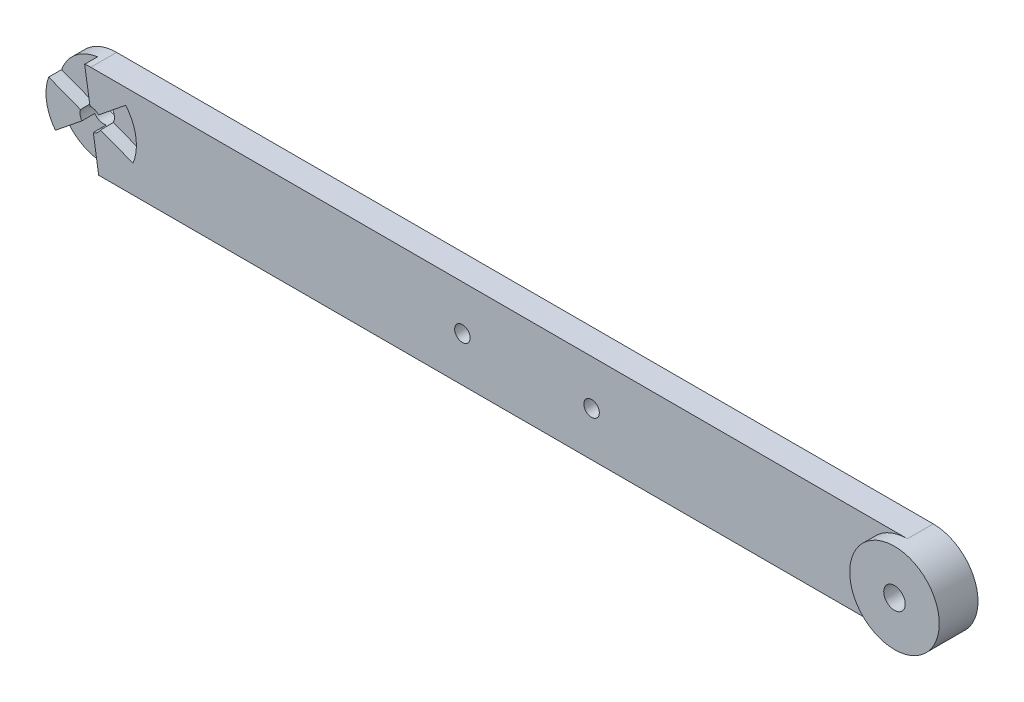
ISO-10303-21;
HEADER;
FILE_DESCRIPTION(('STEP AP214'),'2;1');
FILE_NAME('part.step','',(''),(''),'','','');
FILE_SCHEMA(('AUTOMOTIVE_DESIGN { 1 0 10303 214 1 1 1 1 }'));
ENDSEC;
DATA;
#1=APPLICATION_CONTEXT('core data for automotive mechanical design processes');
#2=APPLICATION_PROTOCOL_DEFINITION('international standard','automotive_design',2000,#1);
#3=PRODUCT_CONTEXT('',#1,'mechanical');
#4=PRODUCT('Part','Part','',(#3));
#5=PRODUCT_RELATED_PRODUCT_CATEGORY('part','',(#4));
#6=PRODUCT_DEFINITION_FORMATION('','',#4);
#7=PRODUCT_DEFINITION_CONTEXT('part definition',#1,'design');
#8=PRODUCT_DEFINITION('design','',#6,#7);
#9=PRODUCT_DEFINITION_SHAPE('','',#8);
#10=(LENGTH_UNIT() NAMED_UNIT(*) SI_UNIT(.MILLI.,.METRE.));
#11=(NAMED_UNIT(*) PLANE_ANGLE_UNIT() SI_UNIT($,.RADIAN.));
#12=(NAMED_UNIT(*) SI_UNIT($,.STERADIAN.) SOLID_ANGLE_UNIT());
#13=UNCERTAINTY_MEASURE_WITH_UNIT(LENGTH_MEASURE(1.E-05),#10,'distance_accuracy_value','');
#14=(GEOMETRIC_REPRESENTATION_CONTEXT(3) GLOBAL_UNCERTAINTY_ASSIGNED_CONTEXT((#13)) GLOBAL_UNIT_ASSIGNED_CONTEXT((#10,
#11,#12)) REPRESENTATION_CONTEXT('',''));
#15=CARTESIAN_POINT('',(0.,0.,0.));
#16=DIRECTION('',(0.,0.,1.));
#17=DIRECTION('',(1.,0.,0.));
#18=AXIS2_PLACEMENT_3D('',#15,#16,#17);
#19=CARTESIAN_POINT('',(0.,0.,0.));
#20=DIRECTION('',(0.,0.,-1.));
#21=DIRECTION('',(1.,0.,0.));
#22=AXIS2_PLACEMENT_3D('',#19,#20,#21);
#23=PLANE('',#22);
#24=CARTESIAN_POINT('',(116.336074353914,-0.0507842874859082,0.));
#25=DIRECTION('',(0.,0.,-1.));
#26=DIRECTION('',(-1.,0.,0.));
#27=AXIS2_PLACEMENT_3D('',#24,#25,#26);
#28=CIRCLE('',#27,1.79999999999999);
#29=CARTESIAN_POINT('',(114.536074353914,-0.0507842874859082,0.));
#30=VERTEX_POINT('',#29);
#31=EDGE_CURVE('E523',#30,#30,#28,.T.);
#32=ORIENTED_EDGE('',*,*,#31,.T.);
#33=EDGE_LOOP('',(#32));
#34=FACE_BOUND('',#33,.T.);
#35=CARTESIAN_POINT('',(86.3361656290088,0.0015439506771131,0.));
#36=DIRECTION('',(0.,0.,-1.));
#37=DIRECTION('',(-1.,0.,0.));
#38=AXIS2_PLACEMENT_3D('',#35,#36,#37);
#39=CIRCLE('',#38,1.79999999999999);
#40=CARTESIAN_POINT('',(84.5361656290088,0.0015439506771131,0.));
#41=VERTEX_POINT('',#40);
#42=EDGE_CURVE('E218',#41,#41,#39,.T.);
#43=ORIENTED_EDGE('',*,*,#42,.T.);
#44=EDGE_LOOP('',(#43));
#45=FACE_BOUND('',#44,.T.);
#46=CARTESIAN_POINT('',(189.7,0.,0.));
#47=DIRECTION('',(0.,0.,-1.));
#48=DIRECTION('',(-1.,0.,0.));
#49=AXIS2_PLACEMENT_3D('',#46,#47,#48);
#50=CIRCLE('',#49,10.4);
#51=CARTESIAN_POINT('',(189.7,-10.4,0.));
#52=VERTEX_POINT('',#51);
#53=CARTESIAN_POINT('',(189.7,10.4,0.));
#54=VERTEX_POINT('',#53);
#55=EDGE_CURVE('E201',#52,#54,#50,.T.);
#56=ORIENTED_EDGE('',*,*,#55,.T.);
#57=DIRECTION('',(-1.,0.,0.));
#58=VECTOR('',#57,1.);
#59=CARTESIAN_POINT('',(0.,10.4,0.));
#60=LINE('',#59,#58);
#61=CARTESIAN_POINT('',(0.,10.4,0.));
#62=VERTEX_POINT('',#61);
#63=EDGE_CURVE('E204',#54,#62,#60,.T.);
#64=ORIENTED_EDGE('',*,*,#63,.T.);
#65=CARTESIAN_POINT('',(0.,0.,0.));
#66=DIRECTION('',(0.,0.,1.));
#67=DIRECTION('',(1.,0.,0.));
#68=AXIS2_PLACEMENT_3D('',#65,#66,#67);
#69=CIRCLE('',#68,10.4);
#70=CARTESIAN_POINT('',(-1.4182915789947,10.3028369392587,0.));
#71=VERTEX_POINT('',#70);
#72=EDGE_CURVE('E299',#62,#71,#69,.T.);
#73=ORIENTED_EDGE('',*,*,#72,.T.);
#74=DIRECTION('',(-0.155400074642872,0.987851616793226,0.));
#75=VECTOR('',#74,1.);
#76=CARTESIAN_POINT('',(0.197570323358645,0.0310800149285744,0.));
#77=LINE('',#76,#75);
#78=CARTESIAN_POINT('',(-0.189684667139674,2.49279355885162,0.));
#79=VERTEX_POINT('',#78);
#80=EDGE_CURVE('E264',#79,#71,#77,.T.);
#81=ORIENTED_EDGE('',*,*,#80,.F.);
#82=CARTESIAN_POINT('',(0.,0.,0.));
#83=DIRECTION('',(0.,0.,1.));
#84=DIRECTION('',(1.,0.,0.));
#85=AXIS2_PLACEMENT_3D('',#82,#83,#84);
#86=CIRCLE('',#85,2.5);
#87=CARTESIAN_POINT('',(1.81257772647093,1.72179034307359,0.));
#88=VERTEX_POINT('',#87);
#89=EDGE_CURVE('E205',#88,#79,#86,.T.);
#90=ORIENTED_EDGE('',*,*,#89,.F.);
#91=DIRECTION('',(0.77780455799102,0.628506220787347,0.));
#92=VECTOR('',#91,1.);
#93=CARTESIAN_POINT('',(-0.12570124415747,0.155560911598204,0.));
#94=LINE('',#93,#92);
#95=CARTESIAN_POINT('',(8.11755938414236,6.81654088559017,0.));
#96=VERTEX_POINT('',#95);
#97=EDGE_CURVE('E215',#88,#96,#94,.T.);
#98=ORIENTED_EDGE('',*,*,#97,.T.);
#99=CARTESIAN_POINT('',(0.,0.,0.));
#100=DIRECTION('',(0.,0.,-1.));
#101=DIRECTION('',(-1.,0.,0.));
#102=AXIS2_PLACEMENT_3D('',#99,#100,#101);
#103=CIRCLE('',#102,10.6);
#104=CARTESIAN_POINT('',(9.81833910652518,-3.99502405365455,0.));
#105=VERTEX_POINT('',#104);
#106=EDGE_CURVE('E234',#96,#105,#103,.T.);
#107=ORIENTED_EDGE('',*,*,#106,.T.);
#108=DIRECTION('',(0.933204632633903,-0.359345396005879,0.));
#109=VECTOR('',#108,1.);
#110=CARTESIAN_POINT('',(-0.0718690792011758,-0.186640926526781,0.));
#111=LINE('',#110,#109);
#112=CARTESIAN_POINT('',(2.25366488192557,-1.08212503897443,0.));
#113=VERTEX_POINT('',#112);
#114=EDGE_CURVE('E224',#113,#105,#111,.T.);
#115=ORIENTED_EDGE('',*,*,#114,.F.);
#116=CARTESIAN_POINT('',(0.584825313856982,-2.43063352899446,0.));
#117=VERTEX_POINT('',#116);
#118=EDGE_CURVE('E287',#117,#113,#86,.T.);
#119=ORIENTED_EDGE('',*,*,#118,.F.);
#120=DIRECTION('',(0.155400074642879,-0.987851616793225,0.));
#121=VECTOR('',#120,1.);
#122=CARTESIAN_POINT('',(0.197570323358645,0.0310800149285759,0.));
#123=LINE('',#122,#121);
#124=CARTESIAN_POINT('',(1.83849552444079,-10.4,0.));
#125=VERTEX_POINT('',#124);
#126=EDGE_CURVE('E203',#117,#125,#123,.T.);
#127=ORIENTED_EDGE('',*,*,#126,.T.);
#128=DIRECTION('',(-1.,0.,0.));
#129=VECTOR('',#128,1.);
#130=CARTESIAN_POINT('',(0.,-10.4,0.));
#131=LINE('',#130,#129);
#132=EDGE_CURVE('E191',#52,#125,#131,.T.);
#133=ORIENTED_EDGE('',*,*,#132,.F.);
#134=EDGE_LOOP('',(#56,#64,#73,#81,#90,#98,#107,#115,#119,#127,#133));
#135=FACE_BOUND('',#134,.T.);
#136=ADVANCED_FACE('F71',(#34,#45,#135),#23,.F.);
#137=CARTESIAN_POINT('',(0.,0.,-6.));
#138=DIRECTION('',(0.,0.,1.));
#139=DIRECTION('',(-1.,0.,0.));
#140=AXIS2_PLACEMENT_3D('',#137,#138,#139);
#141=CYLINDRICAL_SURFACE('',#140,2.5);
#142=CARTESIAN_POINT('',(0.,0.,-6.));
#143=DIRECTION('',(0.,0.,1.));
#144=DIRECTION('',(1.,0.,0.));
#145=AXIS2_PLACEMENT_3D('',#142,#143,#144);
#146=CIRCLE('',#145,2.5);
#147=CARTESIAN_POINT('',(2.5,0.,-6.));
#148=VERTEX_POINT('',#147);
#149=EDGE_CURVE('E295',#148,#148,#146,.T.);
#150=ORIENTED_EDGE('',*,*,#149,.F.);
#151=EDGE_LOOP('',(#150));
#152=FACE_BOUND('',#151,.T.);
#153=CARTESIAN_POINT('',(0.,0.,-3.));
#154=DIRECTION('',(0.,0.,-1.));
#155=DIRECTION('',(-1.,0.,0.));
#156=AXIS2_PLACEMENT_3D('',#153,#154,#155);
#157=CIRCLE('',#156,2.5);
#158=CARTESIAN_POINT('',(-2.06398021478588,-1.41066851987717,-3.));
#159=VERTEX_POINT('',#158);
#160=CARTESIAN_POINT('',(0.584825313856982,-2.43063352899446,-3.));
#161=VERTEX_POINT('',#160);
#162=EDGE_CURVE('E249',#159,#161,#157,.F.);
#163=ORIENTED_EDGE('',*,*,#162,.T.);
#164=DIRECTION('',(0.,0.,1.));
#165=VECTOR('',#164,1.);
#166=CARTESIAN_POINT('',(0.584825313856982,-2.43063352899446,-3.));
#167=LINE('',#166,#165);
#168=EDGE_CURVE('E94',#161,#117,#167,.T.);
#169=ORIENTED_EDGE('',*,*,#168,.T.);
#170=ORIENTED_EDGE('',*,*,#118,.T.);
#171=DIRECTION('',(0.,0.,1.));
#172=VECTOR('',#171,1.);
#173=CARTESIAN_POINT('',(2.25366488192557,-1.08212503897443,-3.));
#174=LINE('',#173,#172);
#175=CARTESIAN_POINT('',(2.25366488192557,-1.08212503897443,-3.));
#176=VERTEX_POINT('',#175);
#177=EDGE_CURVE('E242',#176,#113,#174,.T.);
#178=ORIENTED_EDGE('',*,*,#177,.F.);
#179=CARTESIAN_POINT('',(0.,0.,-3.));
#180=DIRECTION('',(0.,0.,-1.));
#181=DIRECTION('',(-1.,0.,0.));
#182=AXIS2_PLACEMENT_3D('',#179,#180,#181);
#183=CIRCLE('',#182,2.5);
#184=CARTESIAN_POINT('',(1.81257772647093,1.72179034307359,-3.));
#185=VERTEX_POINT('',#184);
#186=EDGE_CURVE('E229',#176,#185,#183,.F.);
#187=ORIENTED_EDGE('',*,*,#186,.T.);
#188=DIRECTION('',(0.,0.,1.));
#189=VECTOR('',#188,1.);
#190=CARTESIAN_POINT('',(1.81257772647093,1.72179034307359,-3.));
#191=LINE('',#190,#189);
#192=EDGE_CURVE('E239',#185,#88,#191,.T.);
#193=ORIENTED_EDGE('',*,*,#192,.T.);
#194=ORIENTED_EDGE('',*,*,#89,.T.);
#195=DIRECTION('',(0.,0.,1.));
#196=VECTOR('',#195,1.);
#197=CARTESIAN_POINT('',(-0.189684667139674,2.49279355885162,-3.));
#198=LINE('',#197,#196);
#199=CARTESIAN_POINT('',(-0.189684667139674,2.49279355885162,-3.));
#200=VERTEX_POINT('',#199);
#201=EDGE_CURVE('E281',#200,#79,#198,.T.);
#202=ORIENTED_EDGE('',*,*,#201,.F.);
#203=CARTESIAN_POINT('',(0.,0.,-3.));
#204=DIRECTION('',(0.,0.,-1.));
#205=DIRECTION('',(-1.,0.,0.));
#206=AXIS2_PLACEMENT_3D('',#203,#204,#205);
#207=CIRCLE('',#206,2.5);
#208=CARTESIAN_POINT('',(-2.39740304032791,0.708843185920889,-3.));
#209=VERTEX_POINT('',#208);
#210=EDGE_CURVE('E272',#200,#209,#207,.F.);
#211=ORIENTED_EDGE('',*,*,#210,.T.);
#212=DIRECTION('',(0.,0.,1.));
#213=VECTOR('',#212,1.);
#214=CARTESIAN_POINT('',(-2.39740304032791,0.708843185920889,-3.));
#215=LINE('',#214,#213);
#216=CARTESIAN_POINT('',(-2.39740304032791,0.708843185920889,0.));
#217=VERTEX_POINT('',#216);
#218=EDGE_CURVE('E291',#209,#217,#215,.T.);
#219=ORIENTED_EDGE('',*,*,#218,.T.);
#220=CARTESIAN_POINT('',(-2.06398021478588,-1.41066851987717,0.));
#221=VERTEX_POINT('',#220);
#222=EDGE_CURVE('E312',#217,#221,#86,.T.);
#223=ORIENTED_EDGE('',*,*,#222,.T.);
#224=DIRECTION('',(0.,0.,1.));
#225=VECTOR('',#224,1.);
#226=CARTESIAN_POINT('',(-2.06398021478588,-1.41066851987717,-3.));
#227=LINE('',#226,#225);
#228=EDGE_CURVE('E258',#159,#221,#227,.T.);
#229=ORIENTED_EDGE('',*,*,#228,.F.);
#230=EDGE_LOOP('',(#163,#169,#170,#178,#187,#193,#194,#202,#211,#219,#223,#229));
#231=FACE_BOUND('',#230,.T.);
#232=ADVANCED_FACE('F73',(#152,#231),#141,.F.);
#233=CARTESIAN_POINT('',(0.,0.,-6.));
#234=DIRECTION('',(0.,0.,1.));
#235=DIRECTION('',(-1.,0.,0.));
#236=AXIS2_PLACEMENT_3D('',#233,#234,#235);
#237=CYLINDRICAL_SURFACE('',#236,10.4);
#238=DIRECTION('',(0.,0.,1.));
#239=VECTOR('',#238,1.);
#240=CARTESIAN_POINT('',(-8.21337273094933,-6.37969500701232,-3.));
#241=LINE('',#240,#239);
#242=CARTESIAN_POINT('',(-8.21337273094933,-6.37969500701232,-3.));
#243=VERTEX_POINT('',#242);
#244=CARTESIAN_POINT('',(-8.21337273094933,-6.37969500701232,0.));
#245=VERTEX_POINT('',#244);
#246=EDGE_CURVE('E261',#243,#245,#241,.T.);
#247=ORIENTED_EDGE('',*,*,#246,.T.);
#248=CARTESIAN_POINT('',(-9.77540246834642,3.54986007919279,0.));
#249=VERTEX_POINT('',#248);
#250=EDGE_CURVE('E315',#249,#245,#69,.T.);
#251=ORIENTED_EDGE('',*,*,#250,.F.);
#252=DIRECTION('',(0.,0.,1.));
#253=VECTOR('',#252,1.);
#254=CARTESIAN_POINT('',(-9.77540246834642,3.54986007919279,-3.));
#255=LINE('',#254,#253);
#256=CARTESIAN_POINT('',(-9.77540246834642,3.54986007919279,-3.));
#257=VERTEX_POINT('',#256);
#258=EDGE_CURVE('E288',#257,#249,#255,.T.);
#259=ORIENTED_EDGE('',*,*,#258,.F.);
#260=CARTESIAN_POINT('',(0.,0.,-3.));
#261=DIRECTION('',(0.,0.,-1.));
#262=DIRECTION('',(-1.,0.,0.));
#263=AXIS2_PLACEMENT_3D('',#260,#261,#262);
#264=CIRCLE('',#263,10.4);
#265=CARTESIAN_POINT('',(-1.4182915789947,10.3028369392587,-3.));
#266=VERTEX_POINT('',#265);
#267=EDGE_CURVE('E278',#257,#266,#264,.T.);
#268=ORIENTED_EDGE('',*,*,#267,.T.);
#269=DIRECTION('',(0.,0.,1.));
#270=VECTOR('',#269,1.);
#271=CARTESIAN_POINT('',(-1.4182915789947,10.3028369392587,-3.));
#272=LINE('',#271,#270);
#273=EDGE_CURVE('E285',#266,#71,#272,.T.);
#274=ORIENTED_EDGE('',*,*,#273,.T.);
#275=ORIENTED_EDGE('',*,*,#72,.F.);
#276=DIRECTION('',(0.,0.,1.));
#277=VECTOR('',#276,1.);
#278=CARTESIAN_POINT('',(0.,10.4,-6.));
#279=LINE('',#278,#277);
#280=CARTESIAN_POINT('',(0.,10.4,-6.));
#281=VERTEX_POINT('',#280);
#282=EDGE_CURVE('E320',#281,#62,#279,.T.);
#283=ORIENTED_EDGE('',*,*,#282,.F.);
#284=CARTESIAN_POINT('',(0.,0.,-6.));
#285=DIRECTION('',(0.,0.,1.));
#286=DIRECTION('',(1.,0.,0.));
#287=AXIS2_PLACEMENT_3D('',#284,#285,#286);
#288=CIRCLE('',#287,10.4);
#289=CARTESIAN_POINT('',(0.,-10.4,-6.));
#290=VERTEX_POINT('',#289);
#291=EDGE_CURVE('E307',#281,#290,#288,.T.);
#292=ORIENTED_EDGE('',*,*,#291,.T.);
#293=DIRECTION('',(0.,0.,1.));
#294=VECTOR('',#293,1.);
#295=CARTESIAN_POINT('',(0.,-10.4,-6.));
#296=LINE('',#295,#294);
#297=CARTESIAN_POINT('',(0.,-10.4,-3.));
#298=VERTEX_POINT('',#297);
#299=EDGE_CURVE('E310',#290,#298,#296,.T.);
#300=ORIENTED_EDGE('',*,*,#299,.T.);
#301=CARTESIAN_POINT('',(0.,0.,-3.));
#302=DIRECTION('',(0.,0.,-1.));
#303=DIRECTION('',(-1.,0.,0.));
#304=AXIS2_PLACEMENT_3D('',#301,#302,#303);
#305=CIRCLE('',#304,10.4);
#306=EDGE_CURVE('E255',#298,#243,#305,.T.);
#307=ORIENTED_EDGE('',*,*,#306,.T.);
#308=EDGE_LOOP('',(#247,#251,#259,#268,#274,#275,#283,#292,#300,#307));
#309=FACE_BOUND('',#308,.T.);
#310=ADVANCED_FACE('F327',(#309),#237,.T.);
#311=DIRECTION('',(-0.777804557991025,-0.628506220787342,0.));
#312=VECTOR('',#311,1.);
#313=CARTESIAN_POINT('',(-0.125701244157469,0.155560911598205,0.));
#314=LINE('',#313,#312);
#315=EDGE_CURVE('E241',#221,#245,#314,.T.);
#316=ORIENTED_EDGE('',*,*,#315,.F.);
#317=ORIENTED_EDGE('',*,*,#222,.F.);
#318=DIRECTION('',(-0.933204632633901,0.359345396005885,0.));
#319=VECTOR('',#318,1.);
#320=CARTESIAN_POINT('',(-0.071869079201177,-0.18664092652678,0.));
#321=LINE('',#320,#319);
#322=EDGE_CURVE('E273',#217,#249,#321,.T.);
#323=ORIENTED_EDGE('',*,*,#322,.T.);
#324=ORIENTED_EDGE('',*,*,#250,.T.);
#325=EDGE_LOOP('',(#316,#317,#323,#324));
#326=FACE_BOUND('',#325,.T.);
#327=ADVANCED_FACE('F351',(#326),#23,.F.);
#328=CARTESIAN_POINT('',(0.,-10.4,-6.));
#329=DIRECTION('',(0.,-1.,0.));
#330=DIRECTION('',(1.,0.,0.));
#331=AXIS2_PLACEMENT_3D('',#328,#329,#330);
#332=PLANE('',#331);
#333=DIRECTION('',(0.,0.,1.));
#334=VECTOR('',#333,1.);
#335=CARTESIAN_POINT('',(1.83849552444079,-10.4,-3.));
#336=LINE('',#335,#334);
#337=CARTESIAN_POINT('',(1.83849552444079,-10.4,-3.));
#338=VERTEX_POINT('',#337);
#339=EDGE_CURVE('E265',#338,#125,#336,.T.);
#340=ORIENTED_EDGE('',*,*,#339,.F.);
#341=DIRECTION('',(-1.,0.,0.));
#342=VECTOR('',#341,1.);
#343=CARTESIAN_POINT('',(0.,-10.4,-3.));
#344=LINE('',#343,#342);
#345=EDGE_CURVE('E253',#338,#298,#344,.T.);
#346=ORIENTED_EDGE('',*,*,#345,.T.);
#347=ORIENTED_EDGE('',*,*,#299,.F.);
#348=DIRECTION('',(-1.,0.,0.));
#349=VECTOR('',#348,1.);
#350=CARTESIAN_POINT('',(0.,-10.4,-6.));
#351=LINE('',#350,#349);
#352=CARTESIAN_POINT('',(189.7,-10.4,-6.));
#353=VERTEX_POINT('',#352);
#354=EDGE_CURVE('E194',#353,#290,#351,.T.);
#355=ORIENTED_EDGE('',*,*,#354,.F.);
#356=DIRECTION('',(0.,0.,1.));
#357=VECTOR('',#356,1.);
#358=CARTESIAN_POINT('',(189.7,-10.4,-6.));
#359=LINE('',#358,#357);
#360=EDGE_CURVE('E12',#353,#52,#359,.T.);
#361=ORIENTED_EDGE('',*,*,#360,.T.);
#362=ORIENTED_EDGE('',*,*,#132,.T.);
#363=EDGE_LOOP('',(#340,#346,#347,#355,#361,#362));
#364=FACE_BOUND('',#363,.T.);
#365=ADVANCED_FACE('F190',(#364),#332,.T.);
#366=CARTESIAN_POINT('',(189.7,0.,-6.));
#367=DIRECTION('',(0.,0.,1.));
#368=DIRECTION('',(-1.,0.,0.));
#369=AXIS2_PLACEMENT_3D('',#366,#367,#368);
#370=CYLINDRICAL_SURFACE('',#369,10.4);
#371=ORIENTED_EDGE('',*,*,#360,.F.);
#372=CARTESIAN_POINT('',(189.7,0.,-6.));
#373=DIRECTION('',(0.,0.,1.));
#374=DIRECTION('',(1.,0.,0.));
#375=AXIS2_PLACEMENT_3D('',#372,#373,#374);
#376=CIRCLE('',#375,10.4);
#377=CARTESIAN_POINT('',(189.7,10.4,-6.));
#378=VERTEX_POINT('',#377);
#379=EDGE_CURVE('E303',#353,#378,#376,.T.);
#380=ORIENTED_EDGE('',*,*,#379,.T.);
#381=DIRECTION('',(0.,0.,1.));
#382=VECTOR('',#381,1.);
#383=CARTESIAN_POINT('',(189.7,10.4,-6.));
#384=LINE('',#383,#382);
#385=EDGE_CURVE('E79',#378,#54,#384,.T.);
#386=ORIENTED_EDGE('',*,*,#385,.T.);
#387=ORIENTED_EDGE('',*,*,#55,.F.);
#388=EDGE_LOOP('',(#371,#380,#386,#387));
#389=FACE_BOUND('',#388,.T.);
#390=CARTESIAN_POINT('',(189.7,0.,3.));
#391=DIRECTION('',(0.,0.,-1.));
#392=DIRECTION('',(1.,0.,0.));
#393=AXIS2_PLACEMENT_3D('',#390,#391,#392);
#394=CIRCLE('',#393,10.4);
#395=CARTESIAN_POINT('',(200.1,0.,3.));
#396=VERTEX_POINT('',#395);
#397=EDGE_CURVE('E211',#396,#396,#394,.T.);
#398=ORIENTED_EDGE('',*,*,#397,.T.);
#399=EDGE_LOOP('',(#398));
#400=FACE_BOUND('',#399,.T.);
#401=ADVANCED_FACE('F207',(#389,#400),#370,.T.);
#402=CARTESIAN_POINT('',(0.,10.4,-6.));
#403=DIRECTION('',(0.,-1.,0.));
#404=DIRECTION('',(1.,0.,0.));
#405=AXIS2_PLACEMENT_3D('',#402,#403,#404);
#406=PLANE('',#405);
#407=ORIENTED_EDGE('',*,*,#63,.F.);
#408=ORIENTED_EDGE('',*,*,#385,.F.);
#409=DIRECTION('',(-1.,0.,0.));
#410=VECTOR('',#409,1.);
#411=CARTESIAN_POINT('',(0.,10.4,-6.));
#412=LINE('',#411,#410);
#413=EDGE_CURVE('E305',#378,#281,#412,.T.);
#414=ORIENTED_EDGE('',*,*,#413,.T.);
#415=ORIENTED_EDGE('',*,*,#282,.T.);
#416=EDGE_LOOP('',(#407,#408,#414,#415));
#417=FACE_BOUND('',#416,.T.);
#418=ADVANCED_FACE('F324',(#417),#406,.F.);
#419=CARTESIAN_POINT('',(189.7,0.,-6.));
#420=DIRECTION('',(0.,0.,1.));
#421=DIRECTION('',(-1.,0.,0.));
#422=AXIS2_PLACEMENT_3D('',#419,#420,#421);
#423=CYLINDRICAL_SURFACE('',#422,2.49999999999997);
#424=CARTESIAN_POINT('',(189.7,0.,-6.));
#425=DIRECTION('',(0.,0.,1.));
#426=DIRECTION('',(1.,0.,0.));
#427=AXIS2_PLACEMENT_3D('',#424,#425,#426);
#428=CIRCLE('',#427,2.49999999999997);
#429=CARTESIAN_POINT('',(192.2,0.,-6.));
#430=VERTEX_POINT('',#429);
#431=EDGE_CURVE('E298',#430,#430,#428,.T.);
#432=ORIENTED_EDGE('',*,*,#431,.F.);
#433=EDGE_LOOP('',(#432));
#434=FACE_BOUND('',#433,.T.);
#435=CARTESIAN_POINT('',(189.7,0.,3.));
#436=DIRECTION('',(0.,0.,-1.));
#437=DIRECTION('',(-1.,0.,0.));
#438=AXIS2_PLACEMENT_3D('',#435,#436,#437);
#439=CIRCLE('',#438,2.49999999999997);
#440=CARTESIAN_POINT('',(187.2,0.,3.));
#441=VERTEX_POINT('',#440);
#442=EDGE_CURVE('E212',#441,#441,#439,.T.);
#443=ORIENTED_EDGE('',*,*,#442,.F.);
#444=EDGE_LOOP('',(#443));
#445=FACE_BOUND('',#444,.T.);
#446=ADVANCED_FACE('F397',(#434,#445),#423,.F.);
#447=CARTESIAN_POINT('',(0.,0.,-6.));
#448=DIRECTION('',(0.,0.,-1.));
#449=DIRECTION('',(1.,0.,0.));
#450=AXIS2_PLACEMENT_3D('',#447,#448,#449);
#451=PLANE('',#450);
#452=CARTESIAN_POINT('',(116.336074353914,-0.0507842874859082,-6.));
#453=DIRECTION('',(0.,0.,-1.));
#454=DIRECTION('',(-1.,0.,0.));
#455=AXIS2_PLACEMENT_3D('',#452,#453,#454);
#456=CIRCLE('',#455,1.79999999999998);
#457=CARTESIAN_POINT('',(114.536074353914,-0.0507842874859082,-6.));
#458=VERTEX_POINT('',#457);
#459=EDGE_CURVE('E521',#458,#458,#456,.T.);
#460=ORIENTED_EDGE('',*,*,#459,.F.);
#461=EDGE_LOOP('',(#460));
#462=FACE_BOUND('',#461,.T.);
#463=CARTESIAN_POINT('',(86.3361656290088,0.0015439506771131,-6.));
#464=DIRECTION('',(0.,0.,-1.));
#465=DIRECTION('',(-1.,0.,0.));
#466=AXIS2_PLACEMENT_3D('',#463,#464,#465);
#467=CIRCLE('',#466,1.79999999999998);
#468=CARTESIAN_POINT('',(84.5361656290088,0.0015439506771131,-6.));
#469=VERTEX_POINT('',#468);
#470=EDGE_CURVE('E524',#469,#469,#467,.T.);
#471=ORIENTED_EDGE('',*,*,#470,.F.);
#472=EDGE_LOOP('',(#471));
#473=FACE_BOUND('',#472,.T.);
#474=ORIENTED_EDGE('',*,*,#149,.T.);
#475=EDGE_LOOP('',(#474));
#476=FACE_BOUND('',#475,.T.);
#477=ORIENTED_EDGE('',*,*,#431,.T.);
#478=EDGE_LOOP('',(#477));
#479=FACE_BOUND('',#478,.T.);
#480=ORIENTED_EDGE('',*,*,#354,.T.);
#481=ORIENTED_EDGE('',*,*,#291,.F.);
#482=ORIENTED_EDGE('',*,*,#413,.F.);
#483=ORIENTED_EDGE('',*,*,#379,.F.);
#484=EDGE_LOOP('',(#480,#481,#482,#483));
#485=FACE_BOUND('',#484,.T.);
#486=ADVANCED_FACE('F400',(#462,#473,#476,#479,#485),#451,.T.);
#487=CARTESIAN_POINT('',(0.197570323358645,0.0310800149285744,-3.));
#488=DIRECTION('',(-0.987851616793226,-0.155400074642872,0.));
#489=DIRECTION('',(0.155400074642872,-0.987851616793226,0.));
#490=AXIS2_PLACEMENT_3D('',#487,#488,#489);
#491=PLANE('',#490);
#492=ORIENTED_EDGE('',*,*,#80,.T.);
#493=ORIENTED_EDGE('',*,*,#273,.F.);
#494=DIRECTION('',(-0.155400074642872,0.987851616793226,0.));
#495=VECTOR('',#494,1.);
#496=CARTESIAN_POINT('',(0.197570323358645,0.0310800149285744,-3.));
#497=LINE('',#496,#495);
#498=EDGE_CURVE('E270',#200,#266,#497,.T.);
#499=ORIENTED_EDGE('',*,*,#498,.F.);
#500=ORIENTED_EDGE('',*,*,#201,.T.);
#501=EDGE_LOOP('',(#492,#493,#499,#500));
#502=FACE_BOUND('',#501,.T.);
#503=ADVANCED_FACE('F332',(#502),#491,.T.);
#504=CARTESIAN_POINT('',(-0.071869079201177,-0.18664092652678,-3.));
#505=DIRECTION('',(-0.359345396005885,-0.933204632633901,0.));
#506=DIRECTION('',(0.933204632633901,-0.359345396005885,0.));
#507=AXIS2_PLACEMENT_3D('',#504,#505,#506);
#508=PLANE('',#507);
#509=ORIENTED_EDGE('',*,*,#322,.F.);
#510=ORIENTED_EDGE('',*,*,#218,.F.);
#511=DIRECTION('',(-0.933204632633901,0.359345396005885,0.));
#512=VECTOR('',#511,1.);
#513=CARTESIAN_POINT('',(-0.071869079201177,-0.18664092652678,-3.));
#514=LINE('',#513,#512);
#515=EDGE_CURVE('E276',#209,#257,#514,.T.);
#516=ORIENTED_EDGE('',*,*,#515,.T.);
#517=ORIENTED_EDGE('',*,*,#258,.T.);
#518=EDGE_LOOP('',(#509,#510,#516,#517));
#519=FACE_BOUND('',#518,.T.);
#520=ADVANCED_FACE('F434',(#519),#508,.F.);
#521=CARTESIAN_POINT('',(0.,0.,-3.));
#522=DIRECTION('',(0.,0.,1.));
#523=DIRECTION('',(-1.,0.,0.));
#524=AXIS2_PLACEMENT_3D('',#521,#522,#523);
#525=PLANE('',#524);
#526=ORIENTED_EDGE('',*,*,#498,.T.);
#527=ORIENTED_EDGE('',*,*,#267,.F.);
#528=ORIENTED_EDGE('',*,*,#515,.F.);
#529=ORIENTED_EDGE('',*,*,#210,.F.);
#530=EDGE_LOOP('',(#526,#527,#528,#529));
#531=FACE_BOUND('',#530,.T.);
#532=ADVANCED_FACE('F430',(#531),#525,.T.);
#533=CARTESIAN_POINT('',(-0.12570124415747,0.155560911598204,-3.));
#534=DIRECTION('',(-0.628506220787347,0.77780455799102,0.));
#535=DIRECTION('',(-0.77780455799102,-0.628506220787347,0.));
#536=AXIS2_PLACEMENT_3D('',#533,#534,#535);
#537=PLANE('',#536);
#538=ORIENTED_EDGE('',*,*,#97,.F.);
#539=ORIENTED_EDGE('',*,*,#192,.F.);
#540=DIRECTION('',(0.77780455799102,0.628506220787347,0.));
#541=VECTOR('',#540,1.);
#542=CARTESIAN_POINT('',(-0.12570124415747,0.155560911598204,-3.));
#543=LINE('',#542,#541);
#544=CARTESIAN_POINT('',(8.11755938414236,6.81654088559017,-3.));
#545=VERTEX_POINT('',#544);
#546=EDGE_CURVE('E221',#185,#545,#543,.T.);
#547=ORIENTED_EDGE('',*,*,#546,.T.);
#548=DIRECTION('',(0.,0.,1.));
#549=VECTOR('',#548,1.);
#550=CARTESIAN_POINT('',(8.11755938414236,6.81654088559017,-3.));
#551=LINE('',#550,#549);
#552=EDGE_CURVE('E86',#545,#96,#551,.T.);
#553=ORIENTED_EDGE('',*,*,#552,.T.);
#554=EDGE_LOOP('',(#538,#539,#547,#553));
#555=FACE_BOUND('',#554,.T.);
#556=ADVANCED_FACE('F338',(#555),#537,.F.);
#557=CARTESIAN_POINT('',(-0.0718690792011758,-0.186640926526781,-3.));
#558=DIRECTION('',(0.359345396005879,0.933204632633903,0.));
#559=DIRECTION('',(-0.933204632633903,0.359345396005879,0.));
#560=AXIS2_PLACEMENT_3D('',#557,#558,#559);
#561=PLANE('',#560);
#562=ORIENTED_EDGE('',*,*,#114,.T.);
#563=DIRECTION('',(0.,0.,1.));
#564=VECTOR('',#563,1.);
#565=CARTESIAN_POINT('',(9.81833910652518,-3.99502405365455,-3.));
#566=LINE('',#565,#564);
#567=CARTESIAN_POINT('',(9.81833910652518,-3.99502405365455,-3.));
#568=VERTEX_POINT('',#567);
#569=EDGE_CURVE('E244',#568,#105,#566,.T.);
#570=ORIENTED_EDGE('',*,*,#569,.F.);
#571=DIRECTION('',(0.933204632633903,-0.359345396005879,0.));
#572=VECTOR('',#571,1.);
#573=CARTESIAN_POINT('',(-0.0718690792011758,-0.186640926526781,-3.));
#574=LINE('',#573,#572);
#575=EDGE_CURVE('E226',#176,#568,#574,.T.);
#576=ORIENTED_EDGE('',*,*,#575,.F.);
#577=ORIENTED_EDGE('',*,*,#177,.T.);
#578=EDGE_LOOP('',(#562,#570,#576,#577));
#579=FACE_BOUND('',#578,.T.);
#580=ADVANCED_FACE('F344',(#579),#561,.T.);
#581=CARTESIAN_POINT('',(0.,0.,-3.));
#582=DIRECTION('',(0.,0.,1.));
#583=DIRECTION('',(-1.,0.,0.));
#584=AXIS2_PLACEMENT_3D('',#581,#582,#583);
#585=CYLINDRICAL_SURFACE('',#584,10.6);
#586=ORIENTED_EDGE('',*,*,#106,.F.);
#587=ORIENTED_EDGE('',*,*,#552,.F.);
#588=CARTESIAN_POINT('',(0.,0.,-3.));
#589=DIRECTION('',(0.,0.,-1.));
#590=DIRECTION('',(-1.,0.,0.));
#591=AXIS2_PLACEMENT_3D('',#588,#589,#590);
#592=CIRCLE('',#591,10.6);
#593=EDGE_CURVE('E223',#545,#568,#592,.T.);
#594=ORIENTED_EDGE('',*,*,#593,.T.);
#595=ORIENTED_EDGE('',*,*,#569,.T.);
#596=EDGE_LOOP('',(#586,#587,#594,#595));
#597=FACE_BOUND('',#596,.T.);
#598=ADVANCED_FACE('F341',(#597),#585,.F.);
#599=CARTESIAN_POINT('',(0.,0.,-3.));
#600=DIRECTION('',(0.,0.,1.));
#601=DIRECTION('',(-1.,0.,0.));
#602=AXIS2_PLACEMENT_3D('',#599,#600,#601);
#603=PLANE('',#602);
#604=ORIENTED_EDGE('',*,*,#546,.F.);
#605=ORIENTED_EDGE('',*,*,#186,.F.);
#606=ORIENTED_EDGE('',*,*,#575,.T.);
#607=ORIENTED_EDGE('',*,*,#593,.F.);
#608=EDGE_LOOP('',(#604,#605,#606,#607));
#609=FACE_BOUND('',#608,.T.);
#610=ADVANCED_FACE('F371',(#609),#603,.T.);
#611=CARTESIAN_POINT('',(-0.125701244157469,0.155560911598205,-3.));
#612=DIRECTION('',(0.628506220787342,-0.777804557991025,0.));
#613=DIRECTION('',(0.777804557991025,0.628506220787342,0.));
#614=AXIS2_PLACEMENT_3D('',#611,#612,#613);
#615=PLANE('',#614);
#616=ORIENTED_EDGE('',*,*,#315,.T.);
#617=ORIENTED_EDGE('',*,*,#246,.F.);
#618=DIRECTION('',(-0.777804557991025,-0.628506220787342,0.));
#619=VECTOR('',#618,1.);
#620=CARTESIAN_POINT('',(-0.125701244157469,0.155560911598205,-3.));
#621=LINE('',#620,#619);
#622=EDGE_CURVE('E247',#159,#243,#621,.T.);
#623=ORIENTED_EDGE('',*,*,#622,.F.);
#624=ORIENTED_EDGE('',*,*,#228,.T.);
#625=EDGE_LOOP('',(#616,#617,#623,#624));
#626=FACE_BOUND('',#625,.T.);
#627=ADVANCED_FACE('F356',(#626),#615,.T.);
#628=CARTESIAN_POINT('',(0.197570323358645,0.0310800149285759,-3.));
#629=DIRECTION('',(0.987851616793224,0.155400074642879,0.));
#630=DIRECTION('',(-0.155400074642879,0.987851616793225,0.));
#631=AXIS2_PLACEMENT_3D('',#628,#629,#630);
#632=PLANE('',#631);
#633=ORIENTED_EDGE('',*,*,#126,.F.);
#634=ORIENTED_EDGE('',*,*,#168,.F.);
#635=DIRECTION('',(0.155400074642879,-0.987851616793225,0.));
#636=VECTOR('',#635,1.);
#637=CARTESIAN_POINT('',(0.197570323358645,0.0310800149285759,-3.));
#638=LINE('',#637,#636);
#639=EDGE_CURVE('E251',#161,#338,#638,.T.);
#640=ORIENTED_EDGE('',*,*,#639,.T.);
#641=ORIENTED_EDGE('',*,*,#339,.T.);
#642=EDGE_LOOP('',(#633,#634,#640,#641));
#643=FACE_BOUND('',#642,.T.);
#644=ADVANCED_FACE('F362',(#643),#632,.F.);
#645=CARTESIAN_POINT('',(0.,0.,-3.));
#646=DIRECTION('',(0.,0.,1.));
#647=DIRECTION('',(-1.,0.,0.));
#648=AXIS2_PLACEMENT_3D('',#645,#646,#647);
#649=PLANE('',#648);
#650=ORIENTED_EDGE('',*,*,#622,.T.);
#651=ORIENTED_EDGE('',*,*,#306,.F.);
#652=ORIENTED_EDGE('',*,*,#345,.F.);
#653=ORIENTED_EDGE('',*,*,#639,.F.);
#654=ORIENTED_EDGE('',*,*,#162,.F.);
#655=EDGE_LOOP('',(#650,#651,#652,#653,#654));
#656=FACE_BOUND('',#655,.T.);
#657=ADVANCED_FACE('F359',(#656),#649,.T.);
#658=CARTESIAN_POINT('',(189.7,0.,3.));
#659=DIRECTION('',(0.,0.,-1.));
#660=DIRECTION('',(1.,0.,0.));
#661=AXIS2_PLACEMENT_3D('',#658,#659,#660);
#662=PLANE('',#661);
#663=ORIENTED_EDGE('',*,*,#397,.F.);
#664=EDGE_LOOP('',(#663));
#665=FACE_BOUND('',#664,.T.);
#666=ORIENTED_EDGE('',*,*,#442,.T.);
#667=EDGE_LOOP('',(#666));
#668=FACE_BOUND('',#667,.T.);
#669=ADVANCED_FACE('F369',(#665,#668),#662,.F.);
#670=CARTESIAN_POINT('',(86.3361656290088,0.0015439506771131,-6.));
#671=DIRECTION('',(0.,0.,-1.));
#672=DIRECTION('',(-1.,0.,0.));
#673=AXIS2_PLACEMENT_3D('',#670,#671,#672);
#674=CYLINDRICAL_SURFACE('',#673,1.79999999999999);
#675=ORIENTED_EDGE('',*,*,#470,.T.);
#676=EDGE_LOOP('',(#675));
#677=FACE_BOUND('',#676,.T.);
#678=ORIENTED_EDGE('',*,*,#42,.F.);
#679=EDGE_LOOP('',(#678));
#680=FACE_BOUND('',#679,.T.);
#681=ADVANCED_FACE('F410',(#677,#680),#674,.F.);
#682=CARTESIAN_POINT('',(116.336074353914,-0.0507842874859082,-6.));
#683=DIRECTION('',(0.,0.,-1.));
#684=DIRECTION('',(-1.,0.,0.));
#685=AXIS2_PLACEMENT_3D('',#682,#683,#684);
#686=CYLINDRICAL_SURFACE('',#685,1.79999999999999);
#687=ORIENTED_EDGE('',*,*,#459,.T.);
#688=EDGE_LOOP('',(#687));
#689=FACE_BOUND('',#688,.T.);
#690=ORIENTED_EDGE('',*,*,#31,.F.);
#691=EDGE_LOOP('',(#690));
#692=FACE_BOUND('',#691,.T.);
#693=ADVANCED_FACE('F416',(#689,#692),#686,.F.);
#694=CLOSED_SHELL('',(#136,#232,#310,#327,#365,#401,#418,#446,#486,#503,#520,#532,#556,#580,
#598,#610,#627,#644,#657,#669,#681,#693));
#695=MANIFOLD_SOLID_BREP('B2',#694);
#696=ADVANCED_BREP_SHAPE_REPRESENTATION('',(#18,#695),#14);
#697=SHAPE_DEFINITION_REPRESENTATION(#9,#696);
ENDSEC;
END-ISO-10303-21;
